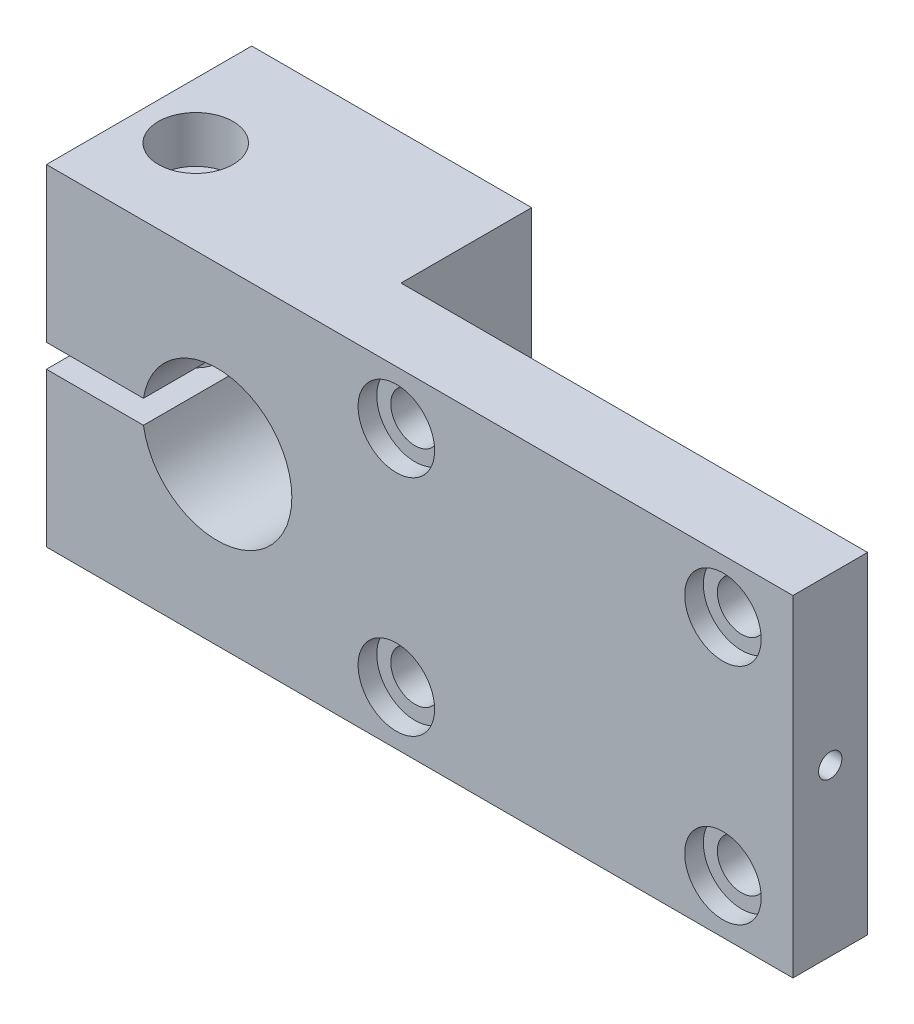
ISO-10303-21;
HEADER;
FILE_DESCRIPTION(('STEP AP214'),'2;1');
FILE_NAME('part.step','',(''),(''),'','','');
FILE_SCHEMA(('AUTOMOTIVE_DESIGN { 1 0 10303 214 1 1 1 1 }'));
ENDSEC;
DATA;
#1=APPLICATION_CONTEXT('core data for automotive mechanical design processes');
#2=APPLICATION_PROTOCOL_DEFINITION('international standard','automotive_design',2000,#1);
#3=PRODUCT_CONTEXT('',#1,'mechanical');
#4=PRODUCT('Part','Part','',(#3));
#5=PRODUCT_RELATED_PRODUCT_CATEGORY('part','',(#4));
#6=PRODUCT_DEFINITION_FORMATION('','',#4);
#7=PRODUCT_DEFINITION_CONTEXT('part definition',#1,'design');
#8=PRODUCT_DEFINITION('design','',#6,#7);
#9=PRODUCT_DEFINITION_SHAPE('','',#8);
#10=(LENGTH_UNIT() NAMED_UNIT(*) SI_UNIT(.MILLI.,.METRE.));
#11=(NAMED_UNIT(*) PLANE_ANGLE_UNIT() SI_UNIT($,.RADIAN.));
#12=(NAMED_UNIT(*) SI_UNIT($,.STERADIAN.) SOLID_ANGLE_UNIT());
#13=UNCERTAINTY_MEASURE_WITH_UNIT(LENGTH_MEASURE(1.E-05),#10,'distance_accuracy_value','');
#14=(GEOMETRIC_REPRESENTATION_CONTEXT(3) GLOBAL_UNCERTAINTY_ASSIGNED_CONTEXT((#13)) GLOBAL_UNIT_ASSIGNED_CONTEXT((#10,
#11,#12)) REPRESENTATION_CONTEXT('',''));
#15=CARTESIAN_POINT('',(0.,0.,0.));
#16=DIRECTION('',(0.,0.,1.));
#17=DIRECTION('',(1.,0.,0.));
#18=AXIS2_PLACEMENT_3D('',#15,#16,#17);
#19=CARTESIAN_POINT('',(-12.3,15.75,12.));
#20=DIRECTION('',(0.,1.,0.));
#21=DIRECTION('',(0.,0.,1.));
#22=AXIS2_PLACEMENT_3D('',#19,#20,#21);
#23=CYLINDRICAL_SURFACE('',#22,2.64999999999999);
#24=CARTESIAN_POINT('',(-12.3,-1.25,12.));
#25=DIRECTION('',(0.,-1.,0.));
#26=DIRECTION('',(0.,0.,-1.));
#27=AXIS2_PLACEMENT_3D('',#24,#25,#26);
#28=CIRCLE('',#27,2.64999999999999);
#29=CARTESIAN_POINT('',(-12.3,-1.25,9.35000000000001));
#30=VERTEX_POINT('',#29);
#31=EDGE_CURVE('E267',#30,#30,#28,.T.);
#32=ORIENTED_EDGE('',*,*,#31,.F.);
#33=EDGE_LOOP('',(#32));
#34=FACE_BOUND('',#33,.T.);
#35=CARTESIAN_POINT('',(-12.3,-7.75,12.));
#36=DIRECTION('',(0.,-1.,0.));
#37=DIRECTION('',(0.,0.,-1.));
#38=AXIS2_PLACEMENT_3D('',#35,#36,#37);
#39=CIRCLE('',#38,2.64999999999999);
#40=CARTESIAN_POINT('',(-12.3,-7.75,9.35000000000001));
#41=VERTEX_POINT('',#40);
#42=EDGE_CURVE('E36',#41,#41,#39,.F.);
#43=ORIENTED_EDGE('',*,*,#42,.F.);
#44=EDGE_LOOP('',(#43));
#45=FACE_BOUND('',#44,.T.);
#46=ADVANCED_FACE('F32',(#34,#45),#23,.F.);
#47=CARTESIAN_POINT('',(-12.3,1.25,12.));
#48=DIRECTION('',(0.,1.,0.));
#49=DIRECTION('',(0.,0.,1.));
#50=AXIS2_PLACEMENT_3D('',#47,#48,#49);
#51=CIRCLE('',#50,2.64999999999999);
#52=CARTESIAN_POINT('',(-12.3,1.25,14.65));
#53=VERTEX_POINT('',#52);
#54=EDGE_CURVE('E270',#53,#53,#51,.T.);
#55=ORIENTED_EDGE('',*,*,#54,.F.);
#56=EDGE_LOOP('',(#55));
#57=FACE_BOUND('',#56,.T.);
#58=CARTESIAN_POINT('',(-12.3,12.75,12.));
#59=DIRECTION('',(0.,1.,0.));
#60=DIRECTION('',(-1.,0.,0.));
#61=AXIS2_PLACEMENT_3D('',#58,#59,#60);
#62=CIRCLE('',#61,2.64999999999999);
#63=CARTESIAN_POINT('',(-14.95,12.75,12.));
#64=VERTEX_POINT('',#63);
#65=EDGE_CURVE('E266',#64,#64,#62,.F.);
#66=ORIENTED_EDGE('',*,*,#65,.F.);
#67=EDGE_LOOP('',(#66));
#68=FACE_BOUND('',#67,.T.);
#69=ADVANCED_FACE('F307',(#57,#68),#23,.F.);
#70=CARTESIAN_POINT('',(0.,0.,22.));
#71=DIRECTION('',(0.,0.,1.));
#72=DIRECTION('',(1.,0.,0.));
#73=AXIS2_PLACEMENT_3D('',#70,#71,#72);
#74=PLANE('',#73);
#75=CARTESIAN_POINT('',(54.2,12.,22.));
#76=DIRECTION('',(0.,0.,1.));
#77=DIRECTION('',(1.,0.,0.));
#78=AXIS2_PLACEMENT_3D('',#75,#76,#77);
#79=CIRCLE('',#78,4.1);
#80=CARTESIAN_POINT('',(58.3,12.,22.));
#81=VERTEX_POINT('',#80);
#82=EDGE_CURVE('E497',#81,#81,#79,.T.);
#83=ORIENTED_EDGE('',*,*,#82,.F.);
#84=EDGE_LOOP('',(#83));
#85=FACE_BOUND('',#84,.T.);
#86=CARTESIAN_POINT('',(19.2,12.,22.));
#87=DIRECTION('',(0.,0.,1.));
#88=DIRECTION('',(1.,0.,0.));
#89=AXIS2_PLACEMENT_3D('',#86,#87,#88);
#90=CIRCLE('',#89,4.1);
#91=CARTESIAN_POINT('',(23.3,12.,22.));
#92=VERTEX_POINT('',#91);
#93=EDGE_CURVE('E489',#92,#92,#90,.T.);
#94=ORIENTED_EDGE('',*,*,#93,.F.);
#95=EDGE_LOOP('',(#94));
#96=FACE_BOUND('',#95,.T.);
#97=CARTESIAN_POINT('',(19.2,-12.,22.));
#98=DIRECTION('',(0.,0.,1.));
#99=DIRECTION('',(1.,0.,0.));
#100=AXIS2_PLACEMENT_3D('',#97,#98,#99);
#101=CIRCLE('',#100,4.1);
#102=CARTESIAN_POINT('',(23.3,-12.,22.));
#103=VERTEX_POINT('',#102);
#104=EDGE_CURVE('E482',#103,#103,#101,.T.);
#105=ORIENTED_EDGE('',*,*,#104,.F.);
#106=EDGE_LOOP('',(#105));
#107=FACE_BOUND('',#106,.T.);
#108=CARTESIAN_POINT('',(54.2,-12.,22.));
#109=DIRECTION('',(0.,0.,1.));
#110=DIRECTION('',(1.,0.,0.));
#111=AXIS2_PLACEMENT_3D('',#108,#109,#110);
#112=CIRCLE('',#111,4.09999999999999);
#113=CARTESIAN_POINT('',(58.3,-12.,22.));
#114=VERTEX_POINT('',#113);
#115=EDGE_CURVE('E486',#114,#114,#112,.T.);
#116=ORIENTED_EDGE('',*,*,#115,.F.);
#117=EDGE_LOOP('',(#116));
#118=FACE_BOUND('',#117,.T.);
#119=DIRECTION('',(0.,-1.,0.));
#120=VECTOR('',#119,1.);
#121=CARTESIAN_POINT('',(-18.3,15.75,22.));
#122=LINE('',#121,#120);
#123=CARTESIAN_POINT('',(-18.3,17.75,22.));
#124=VERTEX_POINT('',#123);
#125=CARTESIAN_POINT('',(-18.3,1.25,22.));
#126=VERTEX_POINT('',#125);
#127=EDGE_CURVE('E280',#124,#126,#122,.T.);
#128=ORIENTED_EDGE('',*,*,#127,.T.);
#129=DIRECTION('',(1.,0.,0.));
#130=VECTOR('',#129,1.);
#131=CARTESIAN_POINT('',(-18.3,1.25,22.));
#132=LINE('',#131,#130);
#133=CARTESIAN_POINT('',(-7.90174031463955,1.25,22.));
#134=VERTEX_POINT('',#133);
#135=EDGE_CURVE('E82',#126,#134,#132,.T.);
#136=ORIENTED_EDGE('',*,*,#135,.T.);
#137=CARTESIAN_POINT('',(0.,0.,22.));
#138=DIRECTION('',(0.,0.,-1.));
#139=DIRECTION('',(1.,0.,0.));
#140=AXIS2_PLACEMENT_3D('',#137,#138,#139);
#141=CIRCLE('',#140,8.);
#142=CARTESIAN_POINT('',(-7.90174031463955,-1.25,22.));
#143=VERTEX_POINT('',#142);
#144=EDGE_CURVE('E284',#134,#143,#141,.T.);
#145=ORIENTED_EDGE('',*,*,#144,.T.);
#146=DIRECTION('',(-1.,0.,0.));
#147=VECTOR('',#146,1.);
#148=CARTESIAN_POINT('',(-7.90174031463955,-1.25,22.));
#149=LINE('',#148,#147);
#150=CARTESIAN_POINT('',(-18.3,-1.25,22.));
#151=VERTEX_POINT('',#150);
#152=EDGE_CURVE('E51',#143,#151,#149,.T.);
#153=ORIENTED_EDGE('',*,*,#152,.T.);
#154=DIRECTION('',(0.,-1.,0.));
#155=VECTOR('',#154,1.);
#156=CARTESIAN_POINT('',(-18.3,-1.25,22.));
#157=LINE('',#156,#155);
#158=CARTESIAN_POINT('',(-18.3,-17.75,22.));
#159=VERTEX_POINT('',#158);
#160=EDGE_CURVE('E287',#151,#159,#157,.T.);
#161=ORIENTED_EDGE('',*,*,#160,.T.);
#162=DIRECTION('',(-1.,0.,0.));
#163=VECTOR('',#162,1.);
#164=CARTESIAN_POINT('',(61.7,-17.75,22.));
#165=LINE('',#164,#163);
#166=CARTESIAN_POINT('',(61.7,-17.75,22.));
#167=VERTEX_POINT('',#166);
#168=EDGE_CURVE('E208',#167,#159,#165,.T.);
#169=ORIENTED_EDGE('',*,*,#168,.F.);
#170=DIRECTION('',(0.,1.,0.));
#171=VECTOR('',#170,1.);
#172=CARTESIAN_POINT('',(61.7,-15.75,22.));
#173=LINE('',#172,#171);
#174=CARTESIAN_POINT('',(61.7,17.75,22.));
#175=VERTEX_POINT('',#174);
#176=EDGE_CURVE('E289',#167,#175,#173,.T.);
#177=ORIENTED_EDGE('',*,*,#176,.T.);
#178=DIRECTION('',(1.,0.,0.));
#179=VECTOR('',#178,1.);
#180=CARTESIAN_POINT('',(-18.3,17.75,22.));
#181=LINE('',#180,#179);
#182=EDGE_CURVE('E217',#124,#175,#181,.T.);
#183=ORIENTED_EDGE('',*,*,#182,.F.);
#184=EDGE_LOOP('',(#128,#136,#145,#153,#161,#169,#177,#183));
#185=FACE_BOUND('',#184,.T.);
#186=ADVANCED_FACE('F309',(#85,#96,#107,#118,#185),#74,.T.);
#187=CARTESIAN_POINT('',(0.,0.,0.));
#188=DIRECTION('',(0.,0.,1.));
#189=DIRECTION('',(1.,0.,0.));
#190=AXIS2_PLACEMENT_3D('',#187,#188,#189);
#191=PLANE('',#190);
#192=DIRECTION('',(0.,-1.,0.));
#193=VECTOR('',#192,1.);
#194=CARTESIAN_POINT('',(-18.3,15.75,0.));
#195=LINE('',#194,#193);
#196=CARTESIAN_POINT('',(-18.3,17.75,0.));
#197=VERTEX_POINT('',#196);
#198=CARTESIAN_POINT('',(-18.3,1.25,0.));
#199=VERTEX_POINT('',#198);
#200=EDGE_CURVE('E279',#197,#199,#195,.T.);
#201=ORIENTED_EDGE('',*,*,#200,.F.);
#202=DIRECTION('',(-1.,0.,0.));
#203=VECTOR('',#202,1.);
#204=CARTESIAN_POINT('',(11.7,17.75,0.));
#205=LINE('',#204,#203);
#206=CARTESIAN_POINT('',(11.7,17.75,0.));
#207=VERTEX_POINT('',#206);
#208=EDGE_CURVE('E229',#207,#197,#205,.T.);
#209=ORIENTED_EDGE('',*,*,#208,.F.);
#210=DIRECTION('',(0.,-1.,0.));
#211=VECTOR('',#210,1.);
#212=CARTESIAN_POINT('',(11.7,0.,0.));
#213=LINE('',#212,#211);
#214=CARTESIAN_POINT('',(11.7,-17.75,0.));
#215=VERTEX_POINT('',#214);
#216=EDGE_CURVE('E277',#207,#215,#213,.T.);
#217=ORIENTED_EDGE('',*,*,#216,.T.);
#218=DIRECTION('',(1.,0.,0.));
#219=VECTOR('',#218,1.);
#220=CARTESIAN_POINT('',(-18.3,-17.75,0.));
#221=LINE('',#220,#219);
#222=CARTESIAN_POINT('',(-18.3,-17.75,0.));
#223=VERTEX_POINT('',#222);
#224=EDGE_CURVE('E196',#223,#215,#221,.T.);
#225=ORIENTED_EDGE('',*,*,#224,.F.);
#226=DIRECTION('',(0.,-1.,0.));
#227=VECTOR('',#226,1.);
#228=CARTESIAN_POINT('',(-18.3,-1.25,0.));
#229=LINE('',#228,#227);
#230=CARTESIAN_POINT('',(-18.3,-1.25,0.));
#231=VERTEX_POINT('',#230);
#232=EDGE_CURVE('E282',#231,#223,#229,.T.);
#233=ORIENTED_EDGE('',*,*,#232,.F.);
#234=DIRECTION('',(-1.,0.,0.));
#235=VECTOR('',#234,1.);
#236=CARTESIAN_POINT('',(-7.90174031463955,-1.25,0.));
#237=LINE('',#236,#235);
#238=CARTESIAN_POINT('',(-7.90174031463955,-1.25,0.));
#239=VERTEX_POINT('',#238);
#240=EDGE_CURVE('E75',#239,#231,#237,.T.);
#241=ORIENTED_EDGE('',*,*,#240,.F.);
#242=CARTESIAN_POINT('',(0.,0.,0.));
#243=DIRECTION('',(0.,0.,-1.));
#244=DIRECTION('',(1.,0.,0.));
#245=AXIS2_PLACEMENT_3D('',#242,#243,#244);
#246=CIRCLE('',#245,8.);
#247=CARTESIAN_POINT('',(-7.90174031463955,1.25,0.));
#248=VERTEX_POINT('',#247);
#249=EDGE_CURVE('E69',#248,#239,#246,.T.);
#250=ORIENTED_EDGE('',*,*,#249,.F.);
#251=DIRECTION('',(1.,0.,0.));
#252=VECTOR('',#251,1.);
#253=CARTESIAN_POINT('',(-18.3,1.25,0.));
#254=LINE('',#253,#252);
#255=EDGE_CURVE('E294',#199,#248,#254,.T.);
#256=ORIENTED_EDGE('',*,*,#255,.F.);
#257=EDGE_LOOP('',(#201,#209,#217,#225,#233,#241,#250,#256));
#258=FACE_BOUND('',#257,.T.);
#259=ADVANCED_FACE('F316',(#258),#191,.F.);
#260=CARTESIAN_POINT('',(-18.3,15.75,22.));
#261=DIRECTION('',(1.,0.,0.));
#262=DIRECTION('',(0.,1.,0.));
#263=AXIS2_PLACEMENT_3D('',#260,#261,#262);
#264=PLANE('',#263);
#265=ORIENTED_EDGE('',*,*,#200,.T.);
#266=DIRECTION('',(0.,0.,-1.));
#267=VECTOR('',#266,1.);
#268=CARTESIAN_POINT('',(-18.3,1.25,22.));
#269=LINE('',#268,#267);
#270=EDGE_CURVE('E11',#126,#199,#269,.T.);
#271=ORIENTED_EDGE('',*,*,#270,.F.);
#272=ORIENTED_EDGE('',*,*,#127,.F.);
#273=DIRECTION('',(0.,0.,1.));
#274=VECTOR('',#273,1.);
#275=CARTESIAN_POINT('',(-18.3,17.75,0.));
#276=LINE('',#275,#274);
#277=EDGE_CURVE('E232',#197,#124,#276,.T.);
#278=ORIENTED_EDGE('',*,*,#277,.F.);
#279=EDGE_LOOP('',(#265,#271,#272,#278));
#280=FACE_BOUND('',#279,.T.);
#281=ADVANCED_FACE('F34',(#280),#264,.F.);
#282=CARTESIAN_POINT('',(-18.3,1.25,22.));
#283=DIRECTION('',(0.,1.,0.));
#284=DIRECTION('',(0.,0.,1.));
#285=AXIS2_PLACEMENT_3D('',#282,#283,#284);
#286=PLANE('',#285);
#287=ORIENTED_EDGE('',*,*,#54,.T.);
#288=EDGE_LOOP('',(#287));
#289=FACE_BOUND('',#288,.T.);
#290=ORIENTED_EDGE('',*,*,#255,.T.);
#291=DIRECTION('',(0.,0.,-1.));
#292=VECTOR('',#291,1.);
#293=CARTESIAN_POINT('',(-7.90174031463955,1.25,22.));
#294=LINE('',#293,#292);
#295=EDGE_CURVE('E42',#134,#248,#294,.T.);
#296=ORIENTED_EDGE('',*,*,#295,.F.);
#297=ORIENTED_EDGE('',*,*,#135,.F.);
#298=ORIENTED_EDGE('',*,*,#270,.T.);
#299=EDGE_LOOP('',(#290,#296,#297,#298));
#300=FACE_BOUND('',#299,.T.);
#301=ADVANCED_FACE('F366',(#289,#300),#286,.F.);
#302=CARTESIAN_POINT('',(0.,0.,22.));
#303=DIRECTION('',(0.,0.,-1.));
#304=DIRECTION('',(-1.,0.,0.));
#305=AXIS2_PLACEMENT_3D('',#302,#303,#304);
#306=CYLINDRICAL_SURFACE('',#305,8.);
#307=ORIENTED_EDGE('',*,*,#249,.T.);
#308=DIRECTION('',(0.,0.,-1.));
#309=VECTOR('',#308,1.);
#310=CARTESIAN_POINT('',(-7.90174031463955,-1.25,22.));
#311=LINE('',#310,#309);
#312=EDGE_CURVE('E300',#143,#239,#311,.T.);
#313=ORIENTED_EDGE('',*,*,#312,.F.);
#314=ORIENTED_EDGE('',*,*,#144,.F.);
#315=ORIENTED_EDGE('',*,*,#295,.T.);
#316=EDGE_LOOP('',(#307,#313,#314,#315));
#317=FACE_BOUND('',#316,.T.);
#318=ADVANCED_FACE('F363',(#317),#306,.F.);
#319=CARTESIAN_POINT('',(-7.90174031463955,-1.25,22.));
#320=DIRECTION('',(0.,-1.,0.));
#321=DIRECTION('',(0.,0.,-1.));
#322=AXIS2_PLACEMENT_3D('',#319,#320,#321);
#323=PLANE('',#322);
#324=ORIENTED_EDGE('',*,*,#31,.T.);
#325=EDGE_LOOP('',(#324));
#326=FACE_BOUND('',#325,.T.);
#327=ORIENTED_EDGE('',*,*,#240,.T.);
#328=DIRECTION('',(0.,0.,-1.));
#329=VECTOR('',#328,1.);
#330=CARTESIAN_POINT('',(-18.3,-1.25,22.));
#331=LINE('',#330,#329);
#332=EDGE_CURVE('E291',#151,#231,#331,.T.);
#333=ORIENTED_EDGE('',*,*,#332,.F.);
#334=ORIENTED_EDGE('',*,*,#152,.F.);
#335=ORIENTED_EDGE('',*,*,#312,.T.);
#336=EDGE_LOOP('',(#327,#333,#334,#335));
#337=FACE_BOUND('',#336,.T.);
#338=ADVANCED_FACE('F359',(#326,#337),#323,.F.);
#339=CARTESIAN_POINT('',(-18.3,-1.25,22.));
#340=DIRECTION('',(1.,0.,0.));
#341=DIRECTION('',(0.,0.,-1.));
#342=AXIS2_PLACEMENT_3D('',#339,#340,#341);
#343=PLANE('',#342);
#344=ORIENTED_EDGE('',*,*,#232,.T.);
#345=DIRECTION('',(0.,0.,-1.));
#346=VECTOR('',#345,1.);
#347=CARTESIAN_POINT('',(-18.3,-17.75,22.));
#348=LINE('',#347,#346);
#349=EDGE_CURVE('E211',#159,#223,#348,.T.);
#350=ORIENTED_EDGE('',*,*,#349,.F.);
#351=ORIENTED_EDGE('',*,*,#160,.F.);
#352=ORIENTED_EDGE('',*,*,#332,.T.);
#353=EDGE_LOOP('',(#344,#350,#351,#352));
#354=FACE_BOUND('',#353,.T.);
#355=ADVANCED_FACE('F355',(#354),#343,.F.);
#356=CARTESIAN_POINT('',(61.7,-15.75,22.));
#357=DIRECTION('',(-1.,0.,0.));
#358=DIRECTION('',(0.,-1.,0.));
#359=AXIS2_PLACEMENT_3D('',#356,#357,#358);
#360=PLANE('',#359);
#361=CARTESIAN_POINT('',(61.7,0.,18.));
#362=DIRECTION('',(1.,0.,0.));
#363=DIRECTION('',(0.,1.,0.));
#364=AXIS2_PLACEMENT_3D('',#361,#362,#363);
#365=CIRCLE('',#364,1.25);
#366=CARTESIAN_POINT('',(61.7,1.25,18.));
#367=VERTEX_POINT('',#366);
#368=EDGE_CURVE('E235',#367,#367,#365,.T.);
#369=ORIENTED_EDGE('',*,*,#368,.F.);
#370=EDGE_LOOP('',(#369));
#371=FACE_BOUND('',#370,.T.);
#372=ORIENTED_EDGE('',*,*,#176,.F.);
#373=DIRECTION('',(0.,0.,1.));
#374=VECTOR('',#373,1.);
#375=CARTESIAN_POINT('',(61.7,-17.75,14.));
#376=LINE('',#375,#374);
#377=CARTESIAN_POINT('',(61.7,-17.75,14.));
#378=VERTEX_POINT('',#377);
#379=EDGE_CURVE('E205',#378,#167,#376,.T.);
#380=ORIENTED_EDGE('',*,*,#379,.F.);
#381=DIRECTION('',(0.,1.,0.));
#382=VECTOR('',#381,1.);
#383=CARTESIAN_POINT('',(61.7,-15.75,14.));
#384=LINE('',#383,#382);
#385=CARTESIAN_POINT('',(61.7,17.75,14.));
#386=VERTEX_POINT('',#385);
#387=EDGE_CURVE('E275',#378,#386,#384,.T.);
#388=ORIENTED_EDGE('',*,*,#387,.T.);
#389=DIRECTION('',(0.,0.,-1.));
#390=VECTOR('',#389,1.);
#391=CARTESIAN_POINT('',(61.7,17.75,22.));
#392=LINE('',#391,#390);
#393=EDGE_CURVE('E220',#175,#386,#392,.T.);
#394=ORIENTED_EDGE('',*,*,#393,.F.);
#395=EDGE_LOOP('',(#372,#380,#388,#394));
#396=FACE_BOUND('',#395,.T.);
#397=ADVANCED_FACE('F347',(#371,#396),#360,.F.);
#398=CARTESIAN_POINT('',(11.7,-26.25,-3.44724645745561));
#399=DIRECTION('',(-1.,0.,0.));
#400=DIRECTION('',(0.,-1.,0.));
#401=AXIS2_PLACEMENT_3D('',#398,#399,#400);
#402=PLANE('',#401);
#403=ORIENTED_EDGE('',*,*,#216,.F.);
#404=DIRECTION('',(0.,0.,-1.));
#405=VECTOR('',#404,1.);
#406=CARTESIAN_POINT('',(11.7,17.75,14.));
#407=LINE('',#406,#405);
#408=CARTESIAN_POINT('',(11.7,17.75,14.));
#409=VERTEX_POINT('',#408);
#410=EDGE_CURVE('E226',#409,#207,#407,.T.);
#411=ORIENTED_EDGE('',*,*,#410,.F.);
#412=DIRECTION('',(0.,1.,0.));
#413=VECTOR('',#412,1.);
#414=CARTESIAN_POINT('',(11.7,-26.25,14.));
#415=LINE('',#414,#413);
#416=CARTESIAN_POINT('',(11.7,-17.75,14.));
#417=VERTEX_POINT('',#416);
#418=EDGE_CURVE('E273',#417,#409,#415,.T.);
#419=ORIENTED_EDGE('',*,*,#418,.F.);
#420=DIRECTION('',(0.,0.,1.));
#421=VECTOR('',#420,1.);
#422=CARTESIAN_POINT('',(11.7,-17.75,0.));
#423=LINE('',#422,#421);
#424=EDGE_CURVE('E199',#215,#417,#423,.T.);
#425=ORIENTED_EDGE('',*,*,#424,.F.);
#426=EDGE_LOOP('',(#403,#411,#419,#425));
#427=FACE_BOUND('',#426,.T.);
#428=ADVANCED_FACE('F344',(#427),#402,.F.);
#429=CARTESIAN_POINT('',(64.2437783075889,-26.25,14.));
#430=DIRECTION('',(0.,0.,1.));
#431=DIRECTION('',(1.,0.,0.));
#432=AXIS2_PLACEMENT_3D('',#429,#430,#431);
#433=PLANE('',#432);
#434=CARTESIAN_POINT('',(19.2,12.,14.));
#435=DIRECTION('',(0.,0.,1.));
#436=DIRECTION('',(1.,0.,0.));
#437=AXIS2_PLACEMENT_3D('',#434,#435,#436);
#438=CIRCLE('',#437,2.6);
#439=CARTESIAN_POINT('',(21.8,12.,14.));
#440=VERTEX_POINT('',#439);
#441=EDGE_CURVE('E178',#440,#440,#438,.T.);
#442=ORIENTED_EDGE('',*,*,#441,.T.);
#443=EDGE_LOOP('',(#442));
#444=FACE_BOUND('',#443,.T.);
#445=CARTESIAN_POINT('',(19.2,-12.,14.));
#446=DIRECTION('',(0.,0.,1.));
#447=DIRECTION('',(1.,0.,0.));
#448=AXIS2_PLACEMENT_3D('',#445,#446,#447);
#449=CIRCLE('',#448,2.6);
#450=CARTESIAN_POINT('',(21.8,-12.,14.));
#451=VERTEX_POINT('',#450);
#452=EDGE_CURVE('E517',#451,#451,#449,.T.);
#453=ORIENTED_EDGE('',*,*,#452,.T.);
#454=EDGE_LOOP('',(#453));
#455=FACE_BOUND('',#454,.T.);
#456=CARTESIAN_POINT('',(54.2,-12.,14.));
#457=DIRECTION('',(0.,0.,1.));
#458=DIRECTION('',(1.,0.,0.));
#459=AXIS2_PLACEMENT_3D('',#456,#457,#458);
#460=CIRCLE('',#459,2.6);
#461=CARTESIAN_POINT('',(56.8,-12.,14.));
#462=VERTEX_POINT('',#461);
#463=EDGE_CURVE('E520',#462,#462,#460,.T.);
#464=ORIENTED_EDGE('',*,*,#463,.T.);
#465=EDGE_LOOP('',(#464));
#466=FACE_BOUND('',#465,.T.);
#467=CARTESIAN_POINT('',(54.2,12.,14.));
#468=DIRECTION('',(0.,0.,1.));
#469=DIRECTION('',(1.,0.,0.));
#470=AXIS2_PLACEMENT_3D('',#467,#468,#469);
#471=CIRCLE('',#470,2.6);
#472=CARTESIAN_POINT('',(56.8,12.,14.));
#473=VERTEX_POINT('',#472);
#474=EDGE_CURVE('E523',#473,#473,#471,.T.);
#475=ORIENTED_EDGE('',*,*,#474,.T.);
#476=EDGE_LOOP('',(#475));
#477=FACE_BOUND('',#476,.T.);
#478=ORIENTED_EDGE('',*,*,#418,.T.);
#479=DIRECTION('',(-1.,0.,0.));
#480=VECTOR('',#479,1.);
#481=CARTESIAN_POINT('',(61.7,17.75,14.));
#482=LINE('',#481,#480);
#483=EDGE_CURVE('E223',#386,#409,#482,.T.);
#484=ORIENTED_EDGE('',*,*,#483,.F.);
#485=ORIENTED_EDGE('',*,*,#387,.F.);
#486=DIRECTION('',(1.,0.,0.));
#487=VECTOR('',#486,1.);
#488=CARTESIAN_POINT('',(11.7,-17.75,14.));
#489=LINE('',#488,#487);
#490=EDGE_CURVE('E202',#417,#378,#489,.T.);
#491=ORIENTED_EDGE('',*,*,#490,.F.);
#492=EDGE_LOOP('',(#478,#484,#485,#491));
#493=FACE_BOUND('',#492,.T.);
#494=ADVANCED_FACE('F337',(#444,#455,#466,#477,#493),#433,.F.);
#495=CARTESIAN_POINT('',(19.2,12.,20.));
#496=DIRECTION('',(0.,0.,1.));
#497=DIRECTION('',(1.,0.,0.));
#498=AXIS2_PLACEMENT_3D('',#495,#496,#497);
#499=PLANE('',#498);
#500=CARTESIAN_POINT('',(19.2,12.,20.));
#501=DIRECTION('',(0.,0.,1.));
#502=DIRECTION('',(1.,0.,0.));
#503=AXIS2_PLACEMENT_3D('',#500,#501,#502);
#504=CIRCLE('',#503,2.6);
#505=CARTESIAN_POINT('',(21.8,12.,20.));
#506=VERTEX_POINT('',#505);
#507=EDGE_CURVE('E503',#506,#506,#504,.T.);
#508=ORIENTED_EDGE('',*,*,#507,.F.);
#509=EDGE_LOOP('',(#508));
#510=FACE_BOUND('',#509,.T.);
#511=CARTESIAN_POINT('',(19.2,12.,20.));
#512=DIRECTION('',(0.,0.,1.));
#513=DIRECTION('',(1.,0.,0.));
#514=AXIS2_PLACEMENT_3D('',#511,#512,#513);
#515=CIRCLE('',#514,4.1);
#516=CARTESIAN_POINT('',(23.3,12.,20.));
#517=VERTEX_POINT('',#516);
#518=EDGE_CURVE('E484',#517,#517,#515,.T.);
#519=ORIENTED_EDGE('',*,*,#518,.T.);
#520=EDGE_LOOP('',(#519));
#521=FACE_BOUND('',#520,.T.);
#522=ADVANCED_FACE('F333',(#510,#521),#499,.T.);
#523=CARTESIAN_POINT('',(54.2,12.,20.));
#524=DIRECTION('',(0.,0.,1.));
#525=DIRECTION('',(1.,0.,0.));
#526=AXIS2_PLACEMENT_3D('',#523,#524,#525);
#527=PLANE('',#526);
#528=CARTESIAN_POINT('',(54.2,12.,20.));
#529=DIRECTION('',(0.,0.,1.));
#530=DIRECTION('',(1.,0.,0.));
#531=AXIS2_PLACEMENT_3D('',#528,#529,#530);
#532=CIRCLE('',#531,2.6);
#533=CARTESIAN_POINT('',(56.8,12.,20.));
#534=VERTEX_POINT('',#533);
#535=EDGE_CURVE('E509',#534,#534,#532,.T.);
#536=ORIENTED_EDGE('',*,*,#535,.F.);
#537=EDGE_LOOP('',(#536));
#538=FACE_BOUND('',#537,.T.);
#539=CARTESIAN_POINT('',(54.2,12.,20.));
#540=DIRECTION('',(0.,0.,1.));
#541=DIRECTION('',(1.,0.,0.));
#542=AXIS2_PLACEMENT_3D('',#539,#540,#541);
#543=CIRCLE('',#542,4.1);
#544=CARTESIAN_POINT('',(58.3,12.,20.));
#545=VERTEX_POINT('',#544);
#546=EDGE_CURVE('E494',#545,#545,#543,.T.);
#547=ORIENTED_EDGE('',*,*,#546,.T.);
#548=EDGE_LOOP('',(#547));
#549=FACE_BOUND('',#548,.T.);
#550=ADVANCED_FACE('F329',(#538,#549),#527,.T.);
#551=CARTESIAN_POINT('',(54.2,-12.,20.));
#552=DIRECTION('',(0.,0.,1.));
#553=DIRECTION('',(1.,0.,0.));
#554=AXIS2_PLACEMENT_3D('',#551,#552,#553);
#555=PLANE('',#554);
#556=CARTESIAN_POINT('',(54.2,-12.,20.));
#557=DIRECTION('',(0.,0.,1.));
#558=DIRECTION('',(1.,0.,0.));
#559=AXIS2_PLACEMENT_3D('',#556,#557,#558);
#560=CIRCLE('',#559,2.6);
#561=CARTESIAN_POINT('',(56.8,-12.,20.));
#562=VERTEX_POINT('',#561);
#563=EDGE_CURVE('E506',#562,#562,#560,.T.);
#564=ORIENTED_EDGE('',*,*,#563,.F.);
#565=EDGE_LOOP('',(#564));
#566=FACE_BOUND('',#565,.T.);
#567=CARTESIAN_POINT('',(54.2,-12.,20.));
#568=DIRECTION('',(0.,0.,1.));
#569=DIRECTION('',(1.,0.,0.));
#570=AXIS2_PLACEMENT_3D('',#567,#568,#569);
#571=CIRCLE('',#570,4.09999999999999);
#572=CARTESIAN_POINT('',(58.3,-12.,20.));
#573=VERTEX_POINT('',#572);
#574=EDGE_CURVE('E500',#573,#573,#571,.T.);
#575=ORIENTED_EDGE('',*,*,#574,.T.);
#576=EDGE_LOOP('',(#575));
#577=FACE_BOUND('',#576,.T.);
#578=ADVANCED_FACE('F325',(#566,#577),#555,.T.);
#579=CARTESIAN_POINT('',(19.2,-12.,20.));
#580=DIRECTION('',(0.,0.,1.));
#581=DIRECTION('',(1.,0.,0.));
#582=AXIS2_PLACEMENT_3D('',#579,#580,#581);
#583=PLANE('',#582);
#584=CARTESIAN_POINT('',(19.2,-12.,20.));
#585=DIRECTION('',(0.,0.,1.));
#586=DIRECTION('',(1.,0.,0.));
#587=AXIS2_PLACEMENT_3D('',#584,#585,#586);
#588=CIRCLE('',#587,2.6);
#589=CARTESIAN_POINT('',(21.8,-12.,20.));
#590=VERTEX_POINT('',#589);
#591=EDGE_CURVE('E510',#590,#590,#588,.T.);
#592=ORIENTED_EDGE('',*,*,#591,.F.);
#593=EDGE_LOOP('',(#592));
#594=FACE_BOUND('',#593,.T.);
#595=CARTESIAN_POINT('',(19.2,-12.,20.));
#596=DIRECTION('',(0.,0.,1.));
#597=DIRECTION('',(1.,0.,0.));
#598=AXIS2_PLACEMENT_3D('',#595,#596,#597);
#599=CIRCLE('',#598,4.1);
#600=CARTESIAN_POINT('',(23.3,-12.,20.));
#601=VERTEX_POINT('',#600);
#602=EDGE_CURVE('E479',#601,#601,#599,.T.);
#603=ORIENTED_EDGE('',*,*,#602,.T.);
#604=EDGE_LOOP('',(#603));
#605=FACE_BOUND('',#604,.T.);
#606=ADVANCED_FACE('F328',(#594,#605),#583,.T.);
#607=CARTESIAN_POINT('',(-12.3,12.75,12.));
#608=DIRECTION('',(0.,1.,0.));
#609=DIRECTION('',(-1.,0.,0.));
#610=AXIS2_PLACEMENT_3D('',#607,#608,#609);
#611=PLANE('',#610);
#612=CARTESIAN_POINT('',(-12.3,12.75,12.));
#613=DIRECTION('',(0.,1.,0.));
#614=DIRECTION('',(-1.,0.,0.));
#615=AXIS2_PLACEMENT_3D('',#612,#613,#614);
#616=CIRCLE('',#615,4.);
#617=CARTESIAN_POINT('',(-16.3,12.75,12.));
#618=VERTEX_POINT('',#617);
#619=EDGE_CURVE('E263',#618,#618,#616,.T.);
#620=ORIENTED_EDGE('',*,*,#619,.T.);
#621=EDGE_LOOP('',(#620));
#622=FACE_BOUND('',#621,.T.);
#623=ORIENTED_EDGE('',*,*,#65,.T.);
#624=EDGE_LOOP('',(#623));
#625=FACE_BOUND('',#624,.T.);
#626=ADVANCED_FACE('F305',(#622,#625),#611,.T.);
#627=CARTESIAN_POINT('',(-12.3,12.75,12.));
#628=DIRECTION('',(0.,1.,0.));
#629=DIRECTION('',(-1.,0.,0.));
#630=AXIS2_PLACEMENT_3D('',#627,#628,#629);
#631=CYLINDRICAL_SURFACE('',#630,4.);
#632=ORIENTED_EDGE('',*,*,#619,.F.);
#633=EDGE_LOOP('',(#632));
#634=FACE_BOUND('',#633,.T.);
#635=CARTESIAN_POINT('',(-12.3,17.75,12.));
#636=DIRECTION('',(0.,1.,0.));
#637=DIRECTION('',(-1.,0.,0.));
#638=AXIS2_PLACEMENT_3D('',#635,#636,#637);
#639=CIRCLE('',#638,4.);
#640=CARTESIAN_POINT('',(-16.3,17.75,12.));
#641=VERTEX_POINT('',#640);
#642=EDGE_CURVE('E214',#641,#641,#639,.T.);
#643=ORIENTED_EDGE('',*,*,#642,.T.);
#644=EDGE_LOOP('',(#643));
#645=FACE_BOUND('',#644,.T.);
#646=ADVANCED_FACE('F323',(#634,#645),#631,.F.);
#647=CARTESIAN_POINT('',(0.,-7.75,0.));
#648=DIRECTION('',(0.,-1.,0.));
#649=DIRECTION('',(0.,0.,-1.));
#650=AXIS2_PLACEMENT_3D('',#647,#648,#649);
#651=PLANE('',#650);
#652=DIRECTION('',(-0.866025403784439,0.,0.5));
#653=VECTOR('',#652,1.);
#654=CARTESIAN_POINT('',(-8.30000000000001,-7.75,14.3094010767585));
#655=LINE('',#654,#653);
#656=CARTESIAN_POINT('',(-8.30000000000001,-7.75,14.3094010767585));
#657=VERTEX_POINT('',#656);
#658=CARTESIAN_POINT('',(-12.3,-7.75,16.618802153517));
#659=VERTEX_POINT('',#658);
#660=EDGE_CURVE('E239',#657,#659,#655,.T.);
#661=ORIENTED_EDGE('',*,*,#660,.T.);
#662=DIRECTION('',(-0.866025403784439,0.,-0.5));
#663=VECTOR('',#662,1.);
#664=CARTESIAN_POINT('',(-12.3,-7.75,16.618802153517));
#665=LINE('',#664,#663);
#666=CARTESIAN_POINT('',(-16.3,-7.75,14.3094010767585));
#667=VERTEX_POINT('',#666);
#668=EDGE_CURVE('E164',#659,#667,#665,.T.);
#669=ORIENTED_EDGE('',*,*,#668,.T.);
#670=DIRECTION('',(0.,0.,-1.));
#671=VECTOR('',#670,1.);
#672=CARTESIAN_POINT('',(-16.3,-7.75,14.3094010767585));
#673=LINE('',#672,#671);
#674=CARTESIAN_POINT('',(-16.3,-7.75,9.69059892324149));
#675=VERTEX_POINT('',#674);
#676=EDGE_CURVE('E244',#667,#675,#673,.T.);
#677=ORIENTED_EDGE('',*,*,#676,.T.);
#678=DIRECTION('',(0.866025403784439,0.,-0.5));
#679=VECTOR('',#678,1.);
#680=CARTESIAN_POINT('',(-16.3,-7.75,9.69059892324149));
#681=LINE('',#680,#679);
#682=CARTESIAN_POINT('',(-12.3,-7.75,7.38119784648299));
#683=VERTEX_POINT('',#682);
#684=EDGE_CURVE('E247',#675,#683,#681,.T.);
#685=ORIENTED_EDGE('',*,*,#684,.T.);
#686=DIRECTION('',(0.866025403784438,0.,0.5));
#687=VECTOR('',#686,1.);
#688=CARTESIAN_POINT('',(-12.3,-7.75,7.38119784648299));
#689=LINE('',#688,#687);
#690=CARTESIAN_POINT('',(-8.30000000000001,-7.75,9.6905989232415));
#691=VERTEX_POINT('',#690);
#692=EDGE_CURVE('E250',#683,#691,#689,.T.);
#693=ORIENTED_EDGE('',*,*,#692,.T.);
#694=DIRECTION('',(0.,0.,1.));
#695=VECTOR('',#694,1.);
#696=CARTESIAN_POINT('',(-8.30000000000001,-7.75,9.6905989232415));
#697=LINE('',#696,#695);
#698=EDGE_CURVE('E169',#691,#657,#697,.T.);
#699=ORIENTED_EDGE('',*,*,#698,.T.);
#700=EDGE_LOOP('',(#661,#669,#677,#685,#693,#699));
#701=FACE_BOUND('',#700,.T.);
#702=ORIENTED_EDGE('',*,*,#42,.T.);
#703=EDGE_LOOP('',(#702));
#704=FACE_BOUND('',#703,.T.);
#705=ADVANCED_FACE('F401',(#701,#704),#651,.T.);
#706=CARTESIAN_POINT('',(-8.30000000000001,-7.75,14.3094010767585));
#707=DIRECTION('',(0.5,0.,0.866025403784439));
#708=DIRECTION('',(0.866025403784439,0.,-0.5));
#709=AXIS2_PLACEMENT_3D('',#706,#707,#708);
#710=PLANE('',#709);
#711=DIRECTION('',(0.,-1.,0.));
#712=VECTOR('',#711,1.);
#713=CARTESIAN_POINT('',(-8.30000000000001,-7.75,14.3094010767585));
#714=LINE('',#713,#712);
#715=CARTESIAN_POINT('',(-8.30000000000001,-17.75,14.3094010767585));
#716=VERTEX_POINT('',#715);
#717=EDGE_CURVE('E174',#657,#716,#714,.T.);
#718=ORIENTED_EDGE('',*,*,#717,.T.);
#719=DIRECTION('',(-0.866025403784439,0.,0.5));
#720=VECTOR('',#719,1.);
#721=CARTESIAN_POINT('',(-8.30000000000001,-17.75,14.3094010767585));
#722=LINE('',#721,#720);
#723=CARTESIAN_POINT('',(-12.3,-17.75,16.618802153517));
#724=VERTEX_POINT('',#723);
#725=EDGE_CURVE('E172',#716,#724,#722,.T.);
#726=ORIENTED_EDGE('',*,*,#725,.T.);
#727=DIRECTION('',(0.,-1.,0.));
#728=VECTOR('',#727,1.);
#729=CARTESIAN_POINT('',(-12.3,-7.75,16.618802153517));
#730=LINE('',#729,#728);
#731=EDGE_CURVE('E157',#659,#724,#730,.T.);
#732=ORIENTED_EDGE('',*,*,#731,.F.);
#733=ORIENTED_EDGE('',*,*,#660,.F.);
#734=EDGE_LOOP('',(#718,#726,#732,#733));
#735=FACE_BOUND('',#734,.T.);
#736=ADVANCED_FACE('F173',(#735),#710,.F.);
#737=CARTESIAN_POINT('',(-8.30000000000001,-7.75,9.6905989232415));
#738=DIRECTION('',(1.,0.,0.));
#739=DIRECTION('',(0.,0.,-1.));
#740=AXIS2_PLACEMENT_3D('',#737,#738,#739);
#741=PLANE('',#740);
#742=DIRECTION('',(0.,-1.,0.));
#743=VECTOR('',#742,1.);
#744=CARTESIAN_POINT('',(-8.30000000000001,-7.75,9.6905989232415));
#745=LINE('',#744,#743);
#746=CARTESIAN_POINT('',(-8.30000000000001,-17.75,9.6905989232415));
#747=VERTEX_POINT('',#746);
#748=EDGE_CURVE('E256',#691,#747,#745,.T.);
#749=ORIENTED_EDGE('',*,*,#748,.T.);
#750=DIRECTION('',(0.,0.,1.));
#751=VECTOR('',#750,1.);
#752=CARTESIAN_POINT('',(-8.30000000000001,-17.75,9.6905989232415));
#753=LINE('',#752,#751);
#754=EDGE_CURVE('E194',#747,#716,#753,.T.);
#755=ORIENTED_EDGE('',*,*,#754,.T.);
#756=ORIENTED_EDGE('',*,*,#717,.F.);
#757=ORIENTED_EDGE('',*,*,#698,.F.);
#758=EDGE_LOOP('',(#749,#755,#756,#757));
#759=FACE_BOUND('',#758,.T.);
#760=ADVANCED_FACE('F416',(#759),#741,.F.);
#761=CARTESIAN_POINT('',(-12.3,-7.75,7.38119784648299));
#762=DIRECTION('',(0.5,0.,-0.866025403784439));
#763=DIRECTION('',(-0.866025403784438,0.,-0.5));
#764=AXIS2_PLACEMENT_3D('',#761,#762,#763);
#765=PLANE('',#764);
#766=DIRECTION('',(0.,-1.,0.));
#767=VECTOR('',#766,1.);
#768=CARTESIAN_POINT('',(-12.3,-7.75,7.38119784648299));
#769=LINE('',#768,#767);
#770=CARTESIAN_POINT('',(-12.3,-17.75,7.38119784648299));
#771=VERTEX_POINT('',#770);
#772=EDGE_CURVE('E258',#683,#771,#769,.T.);
#773=ORIENTED_EDGE('',*,*,#772,.T.);
#774=DIRECTION('',(0.866025403784438,0.,0.5));
#775=VECTOR('',#774,1.);
#776=CARTESIAN_POINT('',(-12.3,-17.75,7.38119784648299));
#777=LINE('',#776,#775);
#778=EDGE_CURVE('E191',#771,#747,#777,.T.);
#779=ORIENTED_EDGE('',*,*,#778,.T.);
#780=ORIENTED_EDGE('',*,*,#748,.F.);
#781=ORIENTED_EDGE('',*,*,#692,.F.);
#782=EDGE_LOOP('',(#773,#779,#780,#781));
#783=FACE_BOUND('',#782,.T.);
#784=ADVANCED_FACE('F427',(#783),#765,.F.);
#785=CARTESIAN_POINT('',(-16.3,-7.75,9.69059892324149));
#786=DIRECTION('',(-0.5,0.,-0.866025403784439));
#787=DIRECTION('',(-0.866025403784439,0.,0.5));
#788=AXIS2_PLACEMENT_3D('',#785,#786,#787);
#789=PLANE('',#788);
#790=DIRECTION('',(0.,-1.,0.));
#791=VECTOR('',#790,1.);
#792=CARTESIAN_POINT('',(-16.3,-7.75,9.69059892324149));
#793=LINE('',#792,#791);
#794=CARTESIAN_POINT('',(-16.3,-17.75,9.69059892324149));
#795=VERTEX_POINT('',#794);
#796=EDGE_CURVE('E260',#675,#795,#793,.T.);
#797=ORIENTED_EDGE('',*,*,#796,.T.);
#798=DIRECTION('',(0.866025403784439,0.,-0.5));
#799=VECTOR('',#798,1.);
#800=CARTESIAN_POINT('',(-16.3,-17.75,9.69059892324149));
#801=LINE('',#800,#799);
#802=EDGE_CURVE('E185',#795,#771,#801,.T.);
#803=ORIENTED_EDGE('',*,*,#802,.T.);
#804=ORIENTED_EDGE('',*,*,#772,.F.);
#805=ORIENTED_EDGE('',*,*,#684,.F.);
#806=EDGE_LOOP('',(#797,#803,#804,#805));
#807=FACE_BOUND('',#806,.T.);
#808=ADVANCED_FACE('F423',(#807),#789,.F.);
#809=CARTESIAN_POINT('',(-16.3,-7.75,14.3094010767585));
#810=DIRECTION('',(-1.,0.,0.));
#811=DIRECTION('',(0.,0.,1.));
#812=AXIS2_PLACEMENT_3D('',#809,#810,#811);
#813=PLANE('',#812);
#814=DIRECTION('',(0.,-1.,0.));
#815=VECTOR('',#814,1.);
#816=CARTESIAN_POINT('',(-16.3,-7.75,14.3094010767585));
#817=LINE('',#816,#815);
#818=CARTESIAN_POINT('',(-16.3,-17.75,14.3094010767585));
#819=VERTEX_POINT('',#818);
#820=EDGE_CURVE('E168',#667,#819,#817,.T.);
#821=ORIENTED_EDGE('',*,*,#820,.T.);
#822=DIRECTION('',(0.,0.,-1.));
#823=VECTOR('',#822,1.);
#824=CARTESIAN_POINT('',(-16.3,-17.75,14.3094010767585));
#825=LINE('',#824,#823);
#826=EDGE_CURVE('E183',#819,#795,#825,.T.);
#827=ORIENTED_EDGE('',*,*,#826,.T.);
#828=ORIENTED_EDGE('',*,*,#796,.F.);
#829=ORIENTED_EDGE('',*,*,#676,.F.);
#830=EDGE_LOOP('',(#821,#827,#828,#829));
#831=FACE_BOUND('',#830,.T.);
#832=ADVANCED_FACE('F420',(#831),#813,.F.);
#833=CARTESIAN_POINT('',(-12.3,-7.75,16.618802153517));
#834=DIRECTION('',(-0.5,0.,0.866025403784439));
#835=DIRECTION('',(0.866025403784439,0.,0.5));
#836=AXIS2_PLACEMENT_3D('',#833,#834,#835);
#837=PLANE('',#836);
#838=ORIENTED_EDGE('',*,*,#731,.T.);
#839=DIRECTION('',(-0.866025403784439,0.,-0.5));
#840=VECTOR('',#839,1.);
#841=CARTESIAN_POINT('',(-12.3,-17.75,16.618802153517));
#842=LINE('',#841,#840);
#843=EDGE_CURVE('E161',#724,#819,#842,.T.);
#844=ORIENTED_EDGE('',*,*,#843,.T.);
#845=ORIENTED_EDGE('',*,*,#820,.F.);
#846=ORIENTED_EDGE('',*,*,#668,.F.);
#847=EDGE_LOOP('',(#838,#844,#845,#846));
#848=FACE_BOUND('',#847,.T.);
#849=ADVANCED_FACE('F159',(#848),#837,.F.);
#850=CARTESIAN_POINT('',(56.7,0.,18.));
#851=DIRECTION('',(1.,0.,0.));
#852=DIRECTION('',(0.,1.,0.));
#853=AXIS2_PLACEMENT_3D('',#850,#851,#852);
#854=CYLINDRICAL_SURFACE('',#853,1.25);
#855=CARTESIAN_POINT('',(56.7,0.,18.));
#856=DIRECTION('',(1.,0.,0.));
#857=DIRECTION('',(0.,1.,0.));
#858=AXIS2_PLACEMENT_3D('',#855,#856,#857);
#859=CIRCLE('',#858,1.25);
#860=CARTESIAN_POINT('',(56.7,1.25,18.));
#861=VERTEX_POINT('',#860);
#862=EDGE_CURVE('E236',#861,#861,#859,.T.);
#863=ORIENTED_EDGE('',*,*,#862,.F.);
#864=EDGE_LOOP('',(#863));
#865=FACE_BOUND('',#864,.T.);
#866=ORIENTED_EDGE('',*,*,#368,.T.);
#867=EDGE_LOOP('',(#866));
#868=FACE_BOUND('',#867,.T.);
#869=ADVANCED_FACE('F419',(#865,#868),#854,.F.);
#870=CARTESIAN_POINT('',(56.7,0.,18.));
#871=DIRECTION('',(1.,0.,0.));
#872=DIRECTION('',(0.,1.,0.));
#873=AXIS2_PLACEMENT_3D('',#870,#871,#872);
#874=PLANE('',#873);
#875=ORIENTED_EDGE('',*,*,#862,.T.);
#876=EDGE_LOOP('',(#875));
#877=FACE_BOUND('',#876,.T.);
#878=ADVANCED_FACE('F396',(#877),#874,.T.);
#879=CARTESIAN_POINT('',(0.,17.75,0.));
#880=DIRECTION('',(0.,1.,0.));
#881=DIRECTION('',(-1.,0.,0.));
#882=AXIS2_PLACEMENT_3D('',#879,#880,#881);
#883=PLANE('',#882);
#884=ORIENTED_EDGE('',*,*,#182,.T.);
#885=ORIENTED_EDGE('',*,*,#393,.T.);
#886=ORIENTED_EDGE('',*,*,#483,.T.);
#887=ORIENTED_EDGE('',*,*,#410,.T.);
#888=ORIENTED_EDGE('',*,*,#208,.T.);
#889=ORIENTED_EDGE('',*,*,#277,.T.);
#890=EDGE_LOOP('',(#884,#885,#886,#887,#888,#889));
#891=FACE_BOUND('',#890,.T.);
#892=ORIENTED_EDGE('',*,*,#642,.F.);
#893=EDGE_LOOP('',(#892));
#894=FACE_BOUND('',#893,.T.);
#895=ADVANCED_FACE('F387',(#891,#894),#883,.T.);
#896=CARTESIAN_POINT('',(0.,-17.75,0.));
#897=DIRECTION('',(0.,-1.,0.));
#898=DIRECTION('',(0.,0.,-1.));
#899=AXIS2_PLACEMENT_3D('',#896,#897,#898);
#900=PLANE('',#899);
#901=ORIENTED_EDGE('',*,*,#224,.T.);
#902=ORIENTED_EDGE('',*,*,#424,.T.);
#903=ORIENTED_EDGE('',*,*,#490,.T.);
#904=ORIENTED_EDGE('',*,*,#379,.T.);
#905=ORIENTED_EDGE('',*,*,#168,.T.);
#906=ORIENTED_EDGE('',*,*,#349,.T.);
#907=EDGE_LOOP('',(#901,#902,#903,#904,#905,#906));
#908=FACE_BOUND('',#907,.T.);
#909=ORIENTED_EDGE('',*,*,#843,.F.);
#910=ORIENTED_EDGE('',*,*,#725,.F.);
#911=ORIENTED_EDGE('',*,*,#754,.F.);
#912=ORIENTED_EDGE('',*,*,#778,.F.);
#913=ORIENTED_EDGE('',*,*,#802,.F.);
#914=ORIENTED_EDGE('',*,*,#826,.F.);
#915=EDGE_LOOP('',(#909,#910,#911,#912,#913,#914));
#916=FACE_BOUND('',#915,.T.);
#917=ADVANCED_FACE('F180',(#908,#916),#900,.T.);
#918=CARTESIAN_POINT('',(19.2,-12.,10.));
#919=DIRECTION('',(0.,0.,1.));
#920=DIRECTION('',(1.,0.,0.));
#921=AXIS2_PLACEMENT_3D('',#918,#919,#920);
#922=CYLINDRICAL_SURFACE('',#921,2.6);
#923=ORIENTED_EDGE('',*,*,#591,.T.);
#924=EDGE_LOOP('',(#923));
#925=FACE_BOUND('',#924,.T.);
#926=ORIENTED_EDGE('',*,*,#452,.F.);
#927=EDGE_LOOP('',(#926));
#928=FACE_BOUND('',#927,.T.);
#929=ADVANCED_FACE('F443',(#925,#928),#922,.F.);
#930=CARTESIAN_POINT('',(54.2,-12.,10.));
#931=DIRECTION('',(0.,0.,1.));
#932=DIRECTION('',(1.,0.,0.));
#933=AXIS2_PLACEMENT_3D('',#930,#931,#932);
#934=CYLINDRICAL_SURFACE('',#933,2.6);
#935=ORIENTED_EDGE('',*,*,#563,.T.);
#936=EDGE_LOOP('',(#935));
#937=FACE_BOUND('',#936,.T.);
#938=ORIENTED_EDGE('',*,*,#463,.F.);
#939=EDGE_LOOP('',(#938));
#940=FACE_BOUND('',#939,.T.);
#941=ADVANCED_FACE('F448',(#937,#940),#934,.F.);
#942=CARTESIAN_POINT('',(54.2,12.,10.));
#943=DIRECTION('',(0.,0.,1.));
#944=DIRECTION('',(1.,0.,0.));
#945=AXIS2_PLACEMENT_3D('',#942,#943,#944);
#946=CYLINDRICAL_SURFACE('',#945,2.6);
#947=ORIENTED_EDGE('',*,*,#535,.T.);
#948=EDGE_LOOP('',(#947));
#949=FACE_BOUND('',#948,.T.);
#950=ORIENTED_EDGE('',*,*,#474,.F.);
#951=EDGE_LOOP('',(#950));
#952=FACE_BOUND('',#951,.T.);
#953=ADVANCED_FACE('F444',(#949,#952),#946,.F.);
#954=CARTESIAN_POINT('',(19.2,12.,10.));
#955=DIRECTION('',(0.,0.,1.));
#956=DIRECTION('',(1.,0.,0.));
#957=AXIS2_PLACEMENT_3D('',#954,#955,#956);
#958=CYLINDRICAL_SURFACE('',#957,2.6);
#959=ORIENTED_EDGE('',*,*,#507,.T.);
#960=EDGE_LOOP('',(#959));
#961=FACE_BOUND('',#960,.T.);
#962=ORIENTED_EDGE('',*,*,#441,.F.);
#963=EDGE_LOOP('',(#962));
#964=FACE_BOUND('',#963,.T.);
#965=ADVANCED_FACE('F447',(#961,#964),#958,.F.);
#966=CARTESIAN_POINT('',(19.2,-12.,20.));
#967=DIRECTION('',(0.,0.,1.));
#968=DIRECTION('',(1.,0.,0.));
#969=AXIS2_PLACEMENT_3D('',#966,#967,#968);
#970=CYLINDRICAL_SURFACE('',#969,4.1);
#971=ORIENTED_EDGE('',*,*,#602,.F.);
#972=EDGE_LOOP('',(#971));
#973=FACE_BOUND('',#972,.T.);
#974=ORIENTED_EDGE('',*,*,#104,.T.);
#975=EDGE_LOOP('',(#974));
#976=FACE_BOUND('',#975,.T.);
#977=ADVANCED_FACE('F452',(#973,#976),#970,.F.);
#978=CARTESIAN_POINT('',(54.2,-12.,20.));
#979=DIRECTION('',(0.,0.,1.));
#980=DIRECTION('',(1.,0.,0.));
#981=AXIS2_PLACEMENT_3D('',#978,#979,#980);
#982=CYLINDRICAL_SURFACE('',#981,4.09999999999999);
#983=ORIENTED_EDGE('',*,*,#574,.F.);
#984=EDGE_LOOP('',(#983));
#985=FACE_BOUND('',#984,.T.);
#986=ORIENTED_EDGE('',*,*,#115,.T.);
#987=EDGE_LOOP('',(#986));
#988=FACE_BOUND('',#987,.T.);
#989=ADVANCED_FACE('F460',(#985,#988),#982,.F.);
#990=CARTESIAN_POINT('',(54.2,12.,20.));
#991=DIRECTION('',(0.,0.,1.));
#992=DIRECTION('',(1.,0.,0.));
#993=AXIS2_PLACEMENT_3D('',#990,#991,#992);
#994=CYLINDRICAL_SURFACE('',#993,4.1);
#995=ORIENTED_EDGE('',*,*,#546,.F.);
#996=EDGE_LOOP('',(#995));
#997=FACE_BOUND('',#996,.T.);
#998=ORIENTED_EDGE('',*,*,#82,.T.);
#999=EDGE_LOOP('',(#998));
#1000=FACE_BOUND('',#999,.T.);
#1001=ADVANCED_FACE('F463',(#997,#1000),#994,.F.);
#1002=CARTESIAN_POINT('',(19.2,12.,20.));
#1003=DIRECTION('',(0.,0.,1.));
#1004=DIRECTION('',(1.,0.,0.));
#1005=AXIS2_PLACEMENT_3D('',#1002,#1003,#1004);
#1006=CYLINDRICAL_SURFACE('',#1005,4.1);
#1007=ORIENTED_EDGE('',*,*,#518,.F.);
#1008=EDGE_LOOP('',(#1007));
#1009=FACE_BOUND('',#1008,.T.);
#1010=ORIENTED_EDGE('',*,*,#93,.T.);
#1011=EDGE_LOOP('',(#1010));
#1012=FACE_BOUND('',#1011,.T.);
#1013=ADVANCED_FACE('F467',(#1009,#1012),#1006,.F.);
#1014=CLOSED_SHELL('',(#46,#69,#186,#259,#281,#301,#318,#338,#355,#397,#428,#494,#522,#550,#578,
#606,#626,#646,#705,#736,#760,#784,#808,#832,#849,#869,#878,#895,#917,#929,#941,#953,#965,#977,
#989,#1001,#1013));
#1015=MANIFOLD_SOLID_BREP('B2',#1014);
#1016=ADVANCED_BREP_SHAPE_REPRESENTATION('',(#18,#1015),#14);
#1017=SHAPE_DEFINITION_REPRESENTATION(#9,#1016);
ENDSEC;
END-ISO-10303-21;
